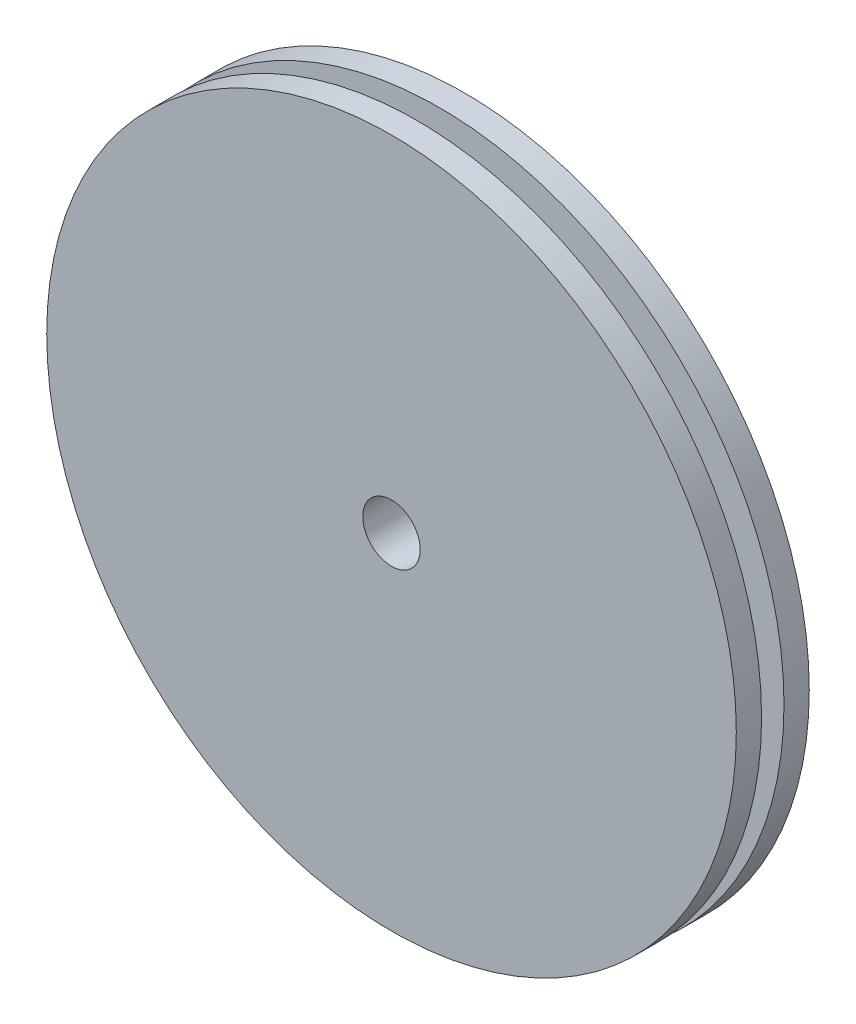
ISO-10303-21;
HEADER;
FILE_DESCRIPTION(('STEP AP214'),'2;1');
FILE_NAME('part.step','',(''),(''),'','','');
FILE_SCHEMA(('AUTOMOTIVE_DESIGN { 1 0 10303 214 1 1 1 1 }'));
ENDSEC;
DATA;
#1=APPLICATION_CONTEXT('core data for automotive mechanical design processes');
#2=APPLICATION_PROTOCOL_DEFINITION('international standard','automotive_design',2000,#1);
#3=PRODUCT_CONTEXT('',#1,'mechanical');
#4=PRODUCT('Part','Part','',(#3));
#5=PRODUCT_RELATED_PRODUCT_CATEGORY('part','',(#4));
#6=PRODUCT_DEFINITION_FORMATION('','',#4);
#7=PRODUCT_DEFINITION_CONTEXT('part definition',#1,'design');
#8=PRODUCT_DEFINITION('design','',#6,#7);
#9=PRODUCT_DEFINITION_SHAPE('','',#8);
#10=(LENGTH_UNIT() NAMED_UNIT(*) SI_UNIT(.MILLI.,.METRE.));
#11=(NAMED_UNIT(*) PLANE_ANGLE_UNIT() SI_UNIT($,.RADIAN.));
#12=(NAMED_UNIT(*) SI_UNIT($,.STERADIAN.) SOLID_ANGLE_UNIT());
#13=UNCERTAINTY_MEASURE_WITH_UNIT(LENGTH_MEASURE(1.E-05),#10,'distance_accuracy_value','');
#14=(GEOMETRIC_REPRESENTATION_CONTEXT(3) GLOBAL_UNCERTAINTY_ASSIGNED_CONTEXT((#13)) GLOBAL_UNIT_ASSIGNED_CONTEXT((#10,
#11,#12)) REPRESENTATION_CONTEXT('',''));
#15=CARTESIAN_POINT('',(0.,0.,0.));
#16=DIRECTION('',(0.,0.,1.));
#17=DIRECTION('',(1.,0.,0.));
#18=AXIS2_PLACEMENT_3D('',#15,#16,#17);
#19=CARTESIAN_POINT('',(0.,0.,4.4));
#20=DIRECTION('',(0.,0.,-1.));
#21=DIRECTION('',(-1.,0.,0.));
#22=AXIS2_PLACEMENT_3D('',#19,#20,#21);
#23=CYLINDRICAL_SURFACE('',#22,60.);
#24=CARTESIAN_POINT('',(0.,0.,4.4));
#25=DIRECTION('',(0.,0.,1.));
#26=DIRECTION('',(1.,0.,0.));
#27=AXIS2_PLACEMENT_3D('',#24,#25,#26);
#28=CIRCLE('',#27,60.);
#29=CARTESIAN_POINT('',(60.,0.,4.4));
#30=VERTEX_POINT('',#29);
#31=EDGE_CURVE('E45',#30,#30,#28,.T.);
#32=ORIENTED_EDGE('',*,*,#31,.F.);
#33=EDGE_LOOP('',(#32));
#34=FACE_BOUND('',#33,.T.);
#35=CARTESIAN_POINT('',(0.,0.,0.));
#36=DIRECTION('',(0.,0.,1.));
#37=DIRECTION('',(1.,0.,0.));
#38=AXIS2_PLACEMENT_3D('',#35,#36,#37);
#39=CIRCLE('',#38,60.);
#40=CARTESIAN_POINT('',(60.,0.,0.));
#41=VERTEX_POINT('',#40);
#42=EDGE_CURVE('E51',#41,#41,#39,.T.);
#43=ORIENTED_EDGE('',*,*,#42,.T.);
#44=EDGE_LOOP('',(#43));
#45=FACE_BOUND('',#44,.T.);
#46=ADVANCED_FACE('F37',(#34,#45),#23,.T.);
#47=CARTESIAN_POINT('',(0.,0.,4.4));
#48=DIRECTION('',(0.,0.,1.));
#49=DIRECTION('',(1.,0.,0.));
#50=AXIS2_PLACEMENT_3D('',#47,#48,#49);
#51=PLANE('',#50);
#52=CARTESIAN_POINT('',(0.,0.,4.4));
#53=DIRECTION('',(0.,0.,1.));
#54=DIRECTION('',(1.,0.,0.));
#55=AXIS2_PLACEMENT_3D('',#52,#53,#54);
#56=CIRCLE('',#55,48.4680893672534);
#57=CARTESIAN_POINT('',(48.4680893672534,0.,4.4));
#58=VERTEX_POINT('',#57);
#59=EDGE_CURVE('E10',#58,#58,#56,.T.);
#60=ORIENTED_EDGE('',*,*,#59,.F.);
#61=EDGE_LOOP('',(#60));
#62=FACE_BOUND('',#61,.T.);
#63=ORIENTED_EDGE('',*,*,#31,.T.);
#64=EDGE_LOOP('',(#63));
#65=FACE_BOUND('',#64,.T.);
#66=ADVANCED_FACE('F117',(#62,#65),#51,.T.);
#67=CARTESIAN_POINT('',(0.,0.,0.));
#68=DIRECTION('',(0.,0.,1.));
#69=DIRECTION('',(1.,0.,0.));
#70=AXIS2_PLACEMENT_3D('',#67,#68,#69);
#71=PLANE('',#70);
#72=CARTESIAN_POINT('',(0.,0.,0.));
#73=DIRECTION('',(0.,0.,1.));
#74=DIRECTION('',(1.,0.,0.));
#75=AXIS2_PLACEMENT_3D('',#72,#73,#74);
#76=CIRCLE('',#75,20.);
#77=CARTESIAN_POINT('',(20.,0.,0.));
#78=VERTEX_POINT('',#77);
#79=EDGE_CURVE('E59',#78,#78,#76,.T.);
#80=ORIENTED_EDGE('',*,*,#79,.T.);
#81=EDGE_LOOP('',(#80));
#82=FACE_BOUND('',#81,.T.);
#83=ORIENTED_EDGE('',*,*,#42,.F.);
#84=EDGE_LOOP('',(#83));
#85=FACE_BOUND('',#84,.T.);
#86=ADVANCED_FACE('F122',(#82,#85),#71,.F.);
#87=CARTESIAN_POINT('',(0.,0.,-16.5));
#88=DIRECTION('',(0.,0.,1.));
#89=DIRECTION('',(1.,0.,0.));
#90=AXIS2_PLACEMENT_3D('',#87,#88,#89);
#91=CYLINDRICAL_SURFACE('',#90,20.);
#92=CARTESIAN_POINT('',(0.,0.,0.400000000000007));
#93=DIRECTION('',(0.,0.,-1.));
#94=DIRECTION('',(-1.,0.,0.));
#95=AXIS2_PLACEMENT_3D('',#92,#93,#94);
#96=CIRCLE('',#95,20.);
#97=CARTESIAN_POINT('',(-20.,0.,0.400000000000007));
#98=VERTEX_POINT('',#97);
#99=EDGE_CURVE('E77',#98,#98,#96,.T.);
#100=ORIENTED_EDGE('',*,*,#99,.F.);
#101=EDGE_LOOP('',(#100));
#102=FACE_BOUND('',#101,.T.);
#103=ORIENTED_EDGE('',*,*,#79,.F.);
#104=EDGE_LOOP('',(#103));
#105=FACE_BOUND('',#104,.T.);
#106=ADVANCED_FACE('F130',(#102,#105),#91,.F.);
#107=CARTESIAN_POINT('',(0.,0.,8.3));
#108=DIRECTION('',(0.,0.,-1.));
#109=DIRECTION('',(-1.,0.,0.));
#110=AXIS2_PLACEMENT_3D('',#107,#108,#109);
#111=CYLINDRICAL_SURFACE('',#110,48.4680893672534);
#112=CARTESIAN_POINT('',(0.,0.,8.3));
#113=DIRECTION('',(0.,0.,1.));
#114=DIRECTION('',(1.,0.,0.));
#115=AXIS2_PLACEMENT_3D('',#112,#113,#114);
#116=CIRCLE('',#115,48.4680893672534);
#117=CARTESIAN_POINT('',(48.4680893672534,0.,8.3));
#118=VERTEX_POINT('',#117);
#119=EDGE_CURVE('E54',#118,#118,#116,.T.);
#120=ORIENTED_EDGE('',*,*,#119,.F.);
#121=EDGE_LOOP('',(#120));
#122=FACE_BOUND('',#121,.T.);
#123=ORIENTED_EDGE('',*,*,#59,.T.);
#124=EDGE_LOOP('',(#123));
#125=FACE_BOUND('',#124,.T.);
#126=ADVANCED_FACE('F112',(#122,#125),#111,.T.);
#127=CARTESIAN_POINT('',(0.,0.,12.7));
#128=DIRECTION('',(0.,0.,-1.));
#129=DIRECTION('',(-1.,0.,0.));
#130=AXIS2_PLACEMENT_3D('',#127,#128,#129);
#131=CYLINDRICAL_SURFACE('',#130,60.);
#132=CARTESIAN_POINT('',(0.,0.,12.7));
#133=DIRECTION('',(0.,0.,1.));
#134=DIRECTION('',(1.,0.,0.));
#135=AXIS2_PLACEMENT_3D('',#132,#133,#134);
#136=CIRCLE('',#135,60.);
#137=CARTESIAN_POINT('',(60.,0.,12.7));
#138=VERTEX_POINT('',#137);
#139=EDGE_CURVE('E66',#138,#138,#136,.T.);
#140=ORIENTED_EDGE('',*,*,#139,.F.);
#141=EDGE_LOOP('',(#140));
#142=FACE_BOUND('',#141,.T.);
#143=CARTESIAN_POINT('',(0.,0.,8.3));
#144=DIRECTION('',(0.,0.,1.));
#145=DIRECTION('',(1.,0.,0.));
#146=AXIS2_PLACEMENT_3D('',#143,#144,#145);
#147=CIRCLE('',#146,60.);
#148=CARTESIAN_POINT('',(60.,0.,8.3));
#149=VERTEX_POINT('',#148);
#150=EDGE_CURVE('E71',#149,#149,#147,.T.);
#151=ORIENTED_EDGE('',*,*,#150,.T.);
#152=EDGE_LOOP('',(#151));
#153=FACE_BOUND('',#152,.T.);
#154=ADVANCED_FACE('F104',(#142,#153),#131,.T.);
#155=CARTESIAN_POINT('',(0.,0.,12.7));
#156=DIRECTION('',(0.,0.,1.));
#157=DIRECTION('',(1.,0.,0.));
#158=AXIS2_PLACEMENT_3D('',#155,#156,#157);
#159=PLANE('',#158);
#160=CARTESIAN_POINT('',(0.,0.,12.7));
#161=DIRECTION('',(0.,0.,1.));
#162=DIRECTION('',(1.,0.,0.));
#163=AXIS2_PLACEMENT_3D('',#160,#161,#162);
#164=CIRCLE('',#163,5.);
#165=CARTESIAN_POINT('',(5.,0.,12.7));
#166=VERTEX_POINT('',#165);
#167=EDGE_CURVE('E40',#166,#166,#164,.T.);
#168=ORIENTED_EDGE('',*,*,#167,.F.);
#169=EDGE_LOOP('',(#168));
#170=FACE_BOUND('',#169,.T.);
#171=ORIENTED_EDGE('',*,*,#139,.T.);
#172=EDGE_LOOP('',(#171));
#173=FACE_BOUND('',#172,.T.);
#174=ADVANCED_FACE('F101',(#170,#173),#159,.T.);
#175=CARTESIAN_POINT('',(0.,0.,8.3));
#176=DIRECTION('',(0.,0.,1.));
#177=DIRECTION('',(1.,0.,0.));
#178=AXIS2_PLACEMENT_3D('',#175,#176,#177);
#179=PLANE('',#178);
#180=ORIENTED_EDGE('',*,*,#119,.T.);
#181=EDGE_LOOP('',(#180));
#182=FACE_BOUND('',#181,.T.);
#183=ORIENTED_EDGE('',*,*,#150,.F.);
#184=EDGE_LOOP('',(#183));
#185=FACE_BOUND('',#184,.T.);
#186=ADVANCED_FACE('F103',(#182,#185),#179,.F.);
#187=CARTESIAN_POINT('',(0.,0.,0.400000000000007));
#188=DIRECTION('',(0.,0.,-1.));
#189=DIRECTION('',(-1.,0.,0.));
#190=AXIS2_PLACEMENT_3D('',#187,#188,#189);
#191=PLANE('',#190);
#192=ORIENTED_EDGE('',*,*,#99,.T.);
#193=EDGE_LOOP('',(#192));
#194=FACE_BOUND('',#193,.T.);
#195=CARTESIAN_POINT('',(0.,0.,0.400000000000007));
#196=DIRECTION('',(0.,0.,-1.));
#197=DIRECTION('',(-1.,0.,0.));
#198=AXIS2_PLACEMENT_3D('',#195,#196,#197);
#199=CIRCLE('',#198,3.);
#200=CARTESIAN_POINT('',(-3.,0.,0.400000000000007));
#201=VERTEX_POINT('',#200);
#202=EDGE_CURVE('E82',#201,#201,#199,.T.);
#203=ORIENTED_EDGE('',*,*,#202,.F.);
#204=EDGE_LOOP('',(#203));
#205=FACE_BOUND('',#204,.T.);
#206=ADVANCED_FACE('F110',(#194,#205),#191,.T.);
#207=CARTESIAN_POINT('',(0.,0.,0.400000000000007));
#208=DIRECTION('',(0.,0.,1.));
#209=DIRECTION('',(1.,0.,0.));
#210=AXIS2_PLACEMENT_3D('',#207,#208,#209);
#211=CYLINDRICAL_SURFACE('',#210,3.);
#212=ORIENTED_EDGE('',*,*,#202,.T.);
#213=EDGE_LOOP('',(#212));
#214=FACE_BOUND('',#213,.T.);
#215=CARTESIAN_POINT('',(0.,0.,4.4));
#216=DIRECTION('',(0.,0.,-1.));
#217=DIRECTION('',(-1.,0.,0.));
#218=AXIS2_PLACEMENT_3D('',#215,#216,#217);
#219=CIRCLE('',#218,3.);
#220=CARTESIAN_POINT('',(-3.,0.,4.4));
#221=VERTEX_POINT('',#220);
#222=EDGE_CURVE('E83',#221,#221,#219,.T.);
#223=ORIENTED_EDGE('',*,*,#222,.F.);
#224=EDGE_LOOP('',(#223));
#225=FACE_BOUND('',#224,.T.);
#226=ADVANCED_FACE('F169',(#214,#225),#211,.F.);
#227=CARTESIAN_POINT('',(0.,0.,20.4));
#228=DIRECTION('',(0.,0.,-1.));
#229=DIRECTION('',(-1.,0.,0.));
#230=AXIS2_PLACEMENT_3D('',#227,#228,#229);
#231=CYLINDRICAL_SURFACE('',#230,5.);
#232=ORIENTED_EDGE('',*,*,#167,.T.);
#233=EDGE_LOOP('',(#232));
#234=FACE_BOUND('',#233,.T.);
#235=CARTESIAN_POINT('',(0.,0.,4.4));
#236=DIRECTION('',(0.,0.,-1.));
#237=DIRECTION('',(-1.,0.,0.));
#238=AXIS2_PLACEMENT_3D('',#235,#236,#237);
#239=CIRCLE('',#238,5.);
#240=CARTESIAN_POINT('',(-5.,0.,4.4));
#241=VERTEX_POINT('',#240);
#242=EDGE_CURVE('E90',#241,#241,#239,.T.);
#243=ORIENTED_EDGE('',*,*,#242,.T.);
#244=EDGE_LOOP('',(#243));
#245=FACE_BOUND('',#244,.T.);
#246=ADVANCED_FACE('F99',(#234,#245),#231,.F.);
#247=CARTESIAN_POINT('',(0.,0.,4.4));
#248=DIRECTION('',(0.,0.,-1.));
#249=DIRECTION('',(-1.,0.,0.));
#250=AXIS2_PLACEMENT_3D('',#247,#248,#249);
#251=PLANE('',#250);
#252=ORIENTED_EDGE('',*,*,#222,.T.);
#253=EDGE_LOOP('',(#252));
#254=FACE_BOUND('',#253,.T.);
#255=ORIENTED_EDGE('',*,*,#242,.F.);
#256=EDGE_LOOP('',(#255));
#257=FACE_BOUND('',#256,.T.);
#258=ADVANCED_FACE('F190',(#254,#257),#251,.F.);
#259=CLOSED_SHELL('',(#46,#66,#86,#106,#126,#154,#174,#186,#206,#226,#246,#258));
#260=MANIFOLD_SOLID_BREP('B2',#259);
#261=ADVANCED_BREP_SHAPE_REPRESENTATION('',(#18,#260),#14);
#262=SHAPE_DEFINITION_REPRESENTATION(#9,#261);
ENDSEC;
END-ISO-10303-21;
